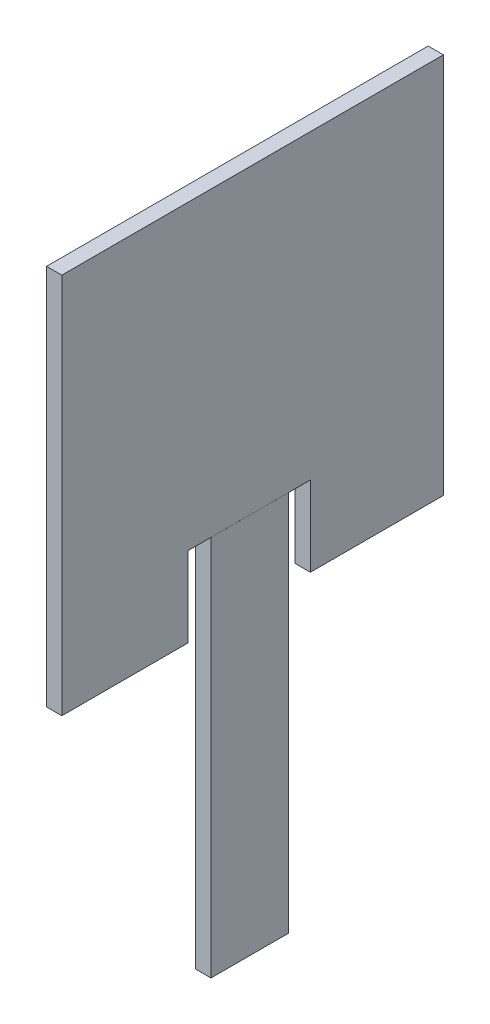
ISO-10303-21;
HEADER;
FILE_DESCRIPTION(('STEP AP214'),'2;1');
FILE_NAME('part.step','',(''),(''),'','','');
FILE_SCHEMA(('AUTOMOTIVE_DESIGN { 1 0 10303 214 1 1 1 1 }'));
ENDSEC;
DATA;
#1=APPLICATION_CONTEXT('core data for automotive mechanical design processes');
#2=APPLICATION_PROTOCOL_DEFINITION('international standard','automotive_design',2000,#1);
#3=PRODUCT_CONTEXT('',#1,'mechanical');
#4=PRODUCT('Part','Part','',(#3));
#5=PRODUCT_RELATED_PRODUCT_CATEGORY('part','',(#4));
#6=PRODUCT_DEFINITION_FORMATION('','',#4);
#7=PRODUCT_DEFINITION_CONTEXT('part definition',#1,'design');
#8=PRODUCT_DEFINITION('design','',#6,#7);
#9=PRODUCT_DEFINITION_SHAPE('','',#8);
#10=(LENGTH_UNIT() NAMED_UNIT(*) SI_UNIT(.MILLI.,.METRE.));
#11=(NAMED_UNIT(*) PLANE_ANGLE_UNIT() SI_UNIT($,.RADIAN.));
#12=(NAMED_UNIT(*) SI_UNIT($,.STERADIAN.) SOLID_ANGLE_UNIT());
#13=UNCERTAINTY_MEASURE_WITH_UNIT(LENGTH_MEASURE(1.E-05),#10,'distance_accuracy_value','');
#14=(GEOMETRIC_REPRESENTATION_CONTEXT(3) GLOBAL_UNCERTAINTY_ASSIGNED_CONTEXT((#13)) GLOBAL_UNIT_ASSIGNED_CONTEXT((#10,
#11,#12)) REPRESENTATION_CONTEXT('',''));
#15=CARTESIAN_POINT('',(0.,0.,0.));
#16=DIRECTION('',(0.,0.,1.));
#17=DIRECTION('',(1.,0.,0.));
#18=AXIS2_PLACEMENT_3D('',#15,#16,#17);
#19=CARTESIAN_POINT('',(-9.9,-0.726274688517492,0.421857304872253));
#20=DIRECTION('',(0.,1.,0.));
#21=DIRECTION('',(0.,0.,1.));
#22=AXIS2_PLACEMENT_3D('',#19,#20,#21);
#23=PLANE('',#22);
#24=DIRECTION('',(1.,0.,0.));
#25=VECTOR('',#24,1.);
#26=CARTESIAN_POINT('',(0.100034455726927,-0.726274688517492,-0.234016313603647));
#27=LINE('',#26,#25);
#28=CARTESIAN_POINT('',(0.,-0.726274688517492,-0.234016313603647));
#29=VERTEX_POINT('',#28);
#30=CARTESIAN_POINT('',(0.1,-0.726274688517492,-0.234016313603647));
#31=VERTEX_POINT('',#30);
#32=EDGE_CURVE('E48',#29,#31,#27,.T.);
#33=ORIENTED_EDGE('',*,*,#32,.F.);
#34=DIRECTION('',(0.,0.,1.));
#35=VECTOR('',#34,1.);
#36=CARTESIAN_POINT('',(0.,-0.726274688517492,0.));
#37=LINE('',#36,#35);
#38=CARTESIAN_POINT('',(0.,-0.726274688517492,-0.378142695127747));
#39=VERTEX_POINT('',#38);
#40=EDGE_CURVE('E151',#39,#29,#37,.T.);
#41=ORIENTED_EDGE('',*,*,#40,.F.);
#42=DIRECTION('',(1.,0.,0.));
#43=VECTOR('',#42,1.);
#44=CARTESIAN_POINT('',(-9.9,-0.726274688517492,-0.378142695127747));
#45=LINE('',#44,#43);
#46=CARTESIAN_POINT('',(0.1,-0.726274688517492,-0.378142695127747));
#47=VERTEX_POINT('',#46);
#48=EDGE_CURVE('E165',#39,#47,#45,.T.);
#49=ORIENTED_EDGE('',*,*,#48,.T.);
#50=DIRECTION('',(0.,0.,1.));
#51=VECTOR('',#50,1.);
#52=CARTESIAN_POINT('',(0.1,-0.726274688517492,0.421857304872253));
#53=LINE('',#52,#51);
#54=EDGE_CURVE('E160',#47,#31,#53,.T.);
#55=ORIENTED_EDGE('',*,*,#54,.T.);
#56=EDGE_LOOP('',(#33,#41,#49,#55));
#57=FACE_BOUND('',#56,.T.);
#58=ADVANCED_FACE('F33',(#57),#23,.F.);
#59=DIRECTION('',(-1.,0.,0.));
#60=VECTOR('',#59,1.);
#61=CARTESIAN_POINT('',(-9.9,-0.726274688517492,0.272866615841139));
#62=LINE('',#61,#60);
#63=CARTESIAN_POINT('',(0.1,-0.726274688517492,0.272866615841139));
#64=VERTEX_POINT('',#63);
#65=CARTESIAN_POINT('',(0.,-0.726274688517492,0.272866615841139));
#66=VERTEX_POINT('',#65);
#67=EDGE_CURVE('E11',#64,#66,#62,.T.);
#68=ORIENTED_EDGE('',*,*,#67,.F.);
#69=CARTESIAN_POINT('',(0.1,-0.726274688517492,0.421857304872253));
#70=VERTEX_POINT('',#69);
#71=EDGE_CURVE('E154',#64,#70,#53,.T.);
#72=ORIENTED_EDGE('',*,*,#71,.T.);
#73=DIRECTION('',(1.,0.,0.));
#74=VECTOR('',#73,1.);
#75=CARTESIAN_POINT('',(-9.9,-0.726274688517492,0.421857304872253));
#76=LINE('',#75,#74);
#77=CARTESIAN_POINT('',(0.,-0.726274688517492,0.421857304872253));
#78=VERTEX_POINT('',#77);
#79=EDGE_CURVE('E166',#78,#70,#76,.T.);
#80=ORIENTED_EDGE('',*,*,#79,.F.);
#81=EDGE_CURVE('E211',#66,#78,#37,.T.);
#82=ORIENTED_EDGE('',*,*,#81,.F.);
#83=EDGE_LOOP('',(#68,#72,#80,#82));
#84=FACE_BOUND('',#83,.T.);
#85=ADVANCED_FACE('F261',(#84),#23,.F.);
#86=CARTESIAN_POINT('',(0.1,-1.25,1.25));
#87=DIRECTION('',(0.,1.,0.));
#88=DIRECTION('',(0.,0.,1.));
#89=AXIS2_PLACEMENT_3D('',#86,#87,#88);
#90=PLANE('',#89);
#91=DIRECTION('',(0.,0.,-1.));
#92=VECTOR('',#91,1.);
#93=CARTESIAN_POINT('',(0.1,-1.25,1.25));
#94=LINE('',#93,#92);
#95=CARTESIAN_POINT('',(0.1,-1.25,-0.378142695127747));
#96=VERTEX_POINT('',#95);
#97=CARTESIAN_POINT('',(0.1,-1.25,-1.25));
#98=VERTEX_POINT('',#97);
#99=EDGE_CURVE('E186',#96,#98,#94,.T.);
#100=ORIENTED_EDGE('',*,*,#99,.F.);
#101=DIRECTION('',(-1.,0.,0.));
#102=VECTOR('',#101,1.);
#103=CARTESIAN_POINT('',(0.1,-1.25,-0.378142695127747));
#104=LINE('',#103,#102);
#105=CARTESIAN_POINT('',(0.,-1.25,-0.378142695127747));
#106=VERTEX_POINT('',#105);
#107=EDGE_CURVE('E174',#96,#106,#104,.T.);
#108=ORIENTED_EDGE('',*,*,#107,.T.);
#109=DIRECTION('',(0.,0.,-1.));
#110=VECTOR('',#109,1.);
#111=CARTESIAN_POINT('',(0.,-1.25,1.25));
#112=LINE('',#111,#110);
#113=CARTESIAN_POINT('',(0.,-1.25,-1.25));
#114=VERTEX_POINT('',#113);
#115=EDGE_CURVE('E197',#106,#114,#112,.T.);
#116=ORIENTED_EDGE('',*,*,#115,.T.);
#117=DIRECTION('',(-1.,0.,0.));
#118=VECTOR('',#117,1.);
#119=CARTESIAN_POINT('',(0.1,-1.25,-1.25));
#120=LINE('',#119,#118);
#121=EDGE_CURVE('E190',#98,#114,#120,.T.);
#122=ORIENTED_EDGE('',*,*,#121,.F.);
#123=EDGE_LOOP('',(#100,#108,#116,#122));
#124=FACE_BOUND('',#123,.T.);
#125=ADVANCED_FACE('F222',(#124),#90,.F.);
#126=CARTESIAN_POINT('',(0.1,1.25,-1.25));
#127=DIRECTION('',(0.,0.,1.));
#128=DIRECTION('',(0.,-1.,0.));
#129=AXIS2_PLACEMENT_3D('',#126,#127,#128);
#130=PLANE('',#129);
#131=DIRECTION('',(0.,1.,0.));
#132=VECTOR('',#131,1.);
#133=CARTESIAN_POINT('',(0.,1.25,-1.25));
#134=LINE('',#133,#132);
#135=CARTESIAN_POINT('',(0.,1.25,-1.25));
#136=VERTEX_POINT('',#135);
#137=EDGE_CURVE('E177',#114,#136,#134,.T.);
#138=ORIENTED_EDGE('',*,*,#137,.T.);
#139=DIRECTION('',(-1.,0.,0.));
#140=VECTOR('',#139,1.);
#141=CARTESIAN_POINT('',(0.1,1.25,-1.25));
#142=LINE('',#141,#140);
#143=CARTESIAN_POINT('',(0.1,1.25,-1.25));
#144=VERTEX_POINT('',#143);
#145=EDGE_CURVE('E208',#144,#136,#142,.T.);
#146=ORIENTED_EDGE('',*,*,#145,.F.);
#147=DIRECTION('',(0.,1.,0.));
#148=VECTOR('',#147,1.);
#149=CARTESIAN_POINT('',(0.1,1.25,-1.25));
#150=LINE('',#149,#148);
#151=EDGE_CURVE('E178',#98,#144,#150,.T.);
#152=ORIENTED_EDGE('',*,*,#151,.F.);
#153=ORIENTED_EDGE('',*,*,#121,.T.);
#154=EDGE_LOOP('',(#138,#146,#152,#153));
#155=FACE_BOUND('',#154,.T.);
#156=ADVANCED_FACE('F35',(#155),#130,.F.);
#157=CARTESIAN_POINT('',(0.1,1.25,1.25));
#158=DIRECTION('',(0.,-1.,0.));
#159=DIRECTION('',(0.,0.,-1.));
#160=AXIS2_PLACEMENT_3D('',#157,#158,#159);
#161=PLANE('',#160);
#162=DIRECTION('',(0.,0.,1.));
#163=VECTOR('',#162,1.);
#164=CARTESIAN_POINT('',(0.,1.25,1.25));
#165=LINE('',#164,#163);
#166=CARTESIAN_POINT('',(0.,1.25,1.25));
#167=VERTEX_POINT('',#166);
#168=EDGE_CURVE('E193',#136,#167,#165,.T.);
#169=ORIENTED_EDGE('',*,*,#168,.T.);
#170=DIRECTION('',(-1.,0.,0.));
#171=VECTOR('',#170,1.);
#172=CARTESIAN_POINT('',(0.1,1.25,1.25));
#173=LINE('',#172,#171);
#174=CARTESIAN_POINT('',(0.1,1.25,1.25));
#175=VERTEX_POINT('',#174);
#176=EDGE_CURVE('E205',#175,#167,#173,.T.);
#177=ORIENTED_EDGE('',*,*,#176,.F.);
#178=DIRECTION('',(0.,0.,1.));
#179=VECTOR('',#178,1.);
#180=CARTESIAN_POINT('',(0.1,1.25,1.25));
#181=LINE('',#180,#179);
#182=EDGE_CURVE('E181',#144,#175,#181,.T.);
#183=ORIENTED_EDGE('',*,*,#182,.F.);
#184=ORIENTED_EDGE('',*,*,#145,.T.);
#185=EDGE_LOOP('',(#169,#177,#183,#184));
#186=FACE_BOUND('',#185,.T.);
#187=ADVANCED_FACE('F280',(#186),#161,.F.);
#188=CARTESIAN_POINT('',(0.1,1.25,1.25));
#189=DIRECTION('',(0.,0.,-1.));
#190=DIRECTION('',(-1.,0.,0.));
#191=AXIS2_PLACEMENT_3D('',#188,#189,#190);
#192=PLANE('',#191);
#193=DIRECTION('',(0.,-1.,0.));
#194=VECTOR('',#193,1.);
#195=CARTESIAN_POINT('',(0.,1.25,1.25));
#196=LINE('',#195,#194);
#197=CARTESIAN_POINT('',(0.,-1.25,1.25));
#198=VERTEX_POINT('',#197);
#199=EDGE_CURVE('E195',#167,#198,#196,.T.);
#200=ORIENTED_EDGE('',*,*,#199,.T.);
#201=DIRECTION('',(-1.,0.,0.));
#202=VECTOR('',#201,1.);
#203=CARTESIAN_POINT('',(0.1,-1.25,1.25));
#204=LINE('',#203,#202);
#205=CARTESIAN_POINT('',(0.1,-1.25,1.25));
#206=VERTEX_POINT('',#205);
#207=EDGE_CURVE('E202',#206,#198,#204,.T.);
#208=ORIENTED_EDGE('',*,*,#207,.F.);
#209=DIRECTION('',(0.,-1.,0.));
#210=VECTOR('',#209,1.);
#211=CARTESIAN_POINT('',(0.1,1.25,1.25));
#212=LINE('',#211,#210);
#213=EDGE_CURVE('E184',#175,#206,#212,.T.);
#214=ORIENTED_EDGE('',*,*,#213,.F.);
#215=ORIENTED_EDGE('',*,*,#176,.T.);
#216=EDGE_LOOP('',(#200,#208,#214,#215));
#217=FACE_BOUND('',#216,.T.);
#218=ADVANCED_FACE('F277',(#217),#192,.F.);
#219=CARTESIAN_POINT('',(0.,-1.25,0.421857304872253));
#220=VERTEX_POINT('',#219);
#221=EDGE_CURVE('E182',#198,#220,#112,.T.);
#222=ORIENTED_EDGE('',*,*,#221,.T.);
#223=DIRECTION('',(1.,0.,0.));
#224=VECTOR('',#223,1.);
#225=CARTESIAN_POINT('',(0.1,-1.25,0.421857304872253));
#226=LINE('',#225,#224);
#227=CARTESIAN_POINT('',(0.1,-1.25,0.421857304872253));
#228=VERTEX_POINT('',#227);
#229=EDGE_CURVE('E169',#220,#228,#226,.T.);
#230=ORIENTED_EDGE('',*,*,#229,.T.);
#231=EDGE_CURVE('E187',#206,#228,#94,.T.);
#232=ORIENTED_EDGE('',*,*,#231,.F.);
#233=ORIENTED_EDGE('',*,*,#207,.T.);
#234=EDGE_LOOP('',(#222,#230,#232,#233));
#235=FACE_BOUND('',#234,.T.);
#236=ADVANCED_FACE('F272',(#235),#90,.F.);
#237=CARTESIAN_POINT('',(0.1,0.,0.));
#238=DIRECTION('',(1.,0.,0.));
#239=DIRECTION('',(0.,0.,-1.));
#240=AXIS2_PLACEMENT_3D('',#237,#238,#239);
#241=PLANE('',#240);
#242=DIRECTION('',(0.,1.,0.));
#243=VECTOR('',#242,1.);
#244=CARTESIAN_POINT('',(0.1,-1.64399945525417,-0.378142695127747));
#245=LINE('',#244,#243);
#246=EDGE_CURVE('E152',#96,#47,#245,.T.);
#247=ORIENTED_EDGE('',*,*,#246,.F.);
#248=ORIENTED_EDGE('',*,*,#99,.T.);
#249=ORIENTED_EDGE('',*,*,#151,.T.);
#250=ORIENTED_EDGE('',*,*,#182,.T.);
#251=ORIENTED_EDGE('',*,*,#213,.T.);
#252=ORIENTED_EDGE('',*,*,#231,.T.);
#253=DIRECTION('',(0.,-1.,0.));
#254=VECTOR('',#253,1.);
#255=CARTESIAN_POINT('',(0.1,-1.64399945525417,0.421857304872253));
#256=LINE('',#255,#254);
#257=EDGE_CURVE('E162',#70,#228,#256,.T.);
#258=ORIENTED_EDGE('',*,*,#257,.F.);
#259=ORIENTED_EDGE('',*,*,#71,.F.);
#260=EDGE_CURVE('E163',#31,#64,#53,.T.);
#261=ORIENTED_EDGE('',*,*,#260,.F.);
#262=ORIENTED_EDGE('',*,*,#54,.F.);
#263=EDGE_LOOP('',(#247,#248,#249,#250,#251,#252,#258,#259,#261,#262));
#264=FACE_BOUND('',#263,.T.);
#265=ADVANCED_FACE('F226',(#264),#241,.T.);
#266=CARTESIAN_POINT('',(0.,0.,0.));
#267=DIRECTION('',(1.,0.,0.));
#268=DIRECTION('',(0.,0.,-1.));
#269=AXIS2_PLACEMENT_3D('',#266,#267,#268);
#270=PLANE('',#269);
#271=ORIENTED_EDGE('',*,*,#115,.F.);
#272=DIRECTION('',(0.,1.,0.));
#273=VECTOR('',#272,1.);
#274=CARTESIAN_POINT('',(0.,0.,-0.378142695127747));
#275=LINE('',#274,#273);
#276=EDGE_CURVE('E41',#106,#39,#275,.T.);
#277=ORIENTED_EDGE('',*,*,#276,.T.);
#278=ORIENTED_EDGE('',*,*,#40,.T.);
#279=DIRECTION('',(0.,1.,0.));
#280=VECTOR('',#279,1.);
#281=CARTESIAN_POINT('',(0.,-3.22627468851749,-0.234016313603647));
#282=LINE('',#281,#280);
#283=CARTESIAN_POINT('',(0.,-3.22627468851749,-0.234016313603647));
#284=VERTEX_POINT('',#283);
#285=EDGE_CURVE('E131',#284,#29,#282,.T.);
#286=ORIENTED_EDGE('',*,*,#285,.F.);
#287=DIRECTION('',(0.,0.,-1.));
#288=VECTOR('',#287,1.);
#289=CARTESIAN_POINT('',(0.,-3.22627468851749,0.272866615841139));
#290=LINE('',#289,#288);
#291=CARTESIAN_POINT('',(0.,-3.22627468851749,0.272866615841139));
#292=VERTEX_POINT('',#291);
#293=EDGE_CURVE('E137',#292,#284,#290,.T.);
#294=ORIENTED_EDGE('',*,*,#293,.F.);
#295=DIRECTION('',(0.,1.,0.));
#296=VECTOR('',#295,1.);
#297=CARTESIAN_POINT('',(0.,-3.22627468851749,0.272866615841139));
#298=LINE('',#297,#296);
#299=EDGE_CURVE('E244',#292,#66,#298,.T.);
#300=ORIENTED_EDGE('',*,*,#299,.T.);
#301=ORIENTED_EDGE('',*,*,#81,.T.);
#302=DIRECTION('',(0.,-1.,0.));
#303=VECTOR('',#302,1.);
#304=CARTESIAN_POINT('',(0.,0.,0.421857304872253));
#305=LINE('',#304,#303);
#306=EDGE_CURVE('E213',#78,#220,#305,.T.);
#307=ORIENTED_EDGE('',*,*,#306,.T.);
#308=ORIENTED_EDGE('',*,*,#221,.F.);
#309=ORIENTED_EDGE('',*,*,#199,.F.);
#310=ORIENTED_EDGE('',*,*,#168,.F.);
#311=ORIENTED_EDGE('',*,*,#137,.F.);
#312=EDGE_LOOP('',(#271,#277,#278,#286,#294,#300,#301,#307,#308,#309,#310,#311));
#313=FACE_BOUND('',#312,.T.);
#314=ADVANCED_FACE('F149',(#313),#270,.F.);
#315=CARTESIAN_POINT('',(-9.9,-1.64399945525417,-0.378142695127747));
#316=DIRECTION('',(0.,0.,-1.));
#317=DIRECTION('',(-1.,0.,0.));
#318=AXIS2_PLACEMENT_3D('',#315,#316,#317);
#319=PLANE('',#318);
#320=ORIENTED_EDGE('',*,*,#246,.T.);
#321=ORIENTED_EDGE('',*,*,#48,.F.);
#322=ORIENTED_EDGE('',*,*,#276,.F.);
#323=ORIENTED_EDGE('',*,*,#107,.F.);
#324=EDGE_LOOP('',(#320,#321,#322,#323));
#325=FACE_BOUND('',#324,.T.);
#326=ADVANCED_FACE('F218',(#325),#319,.F.);
#327=CARTESIAN_POINT('',(-9.9,-1.64399945525417,0.421857304872253));
#328=DIRECTION('',(0.,0.,1.));
#329=DIRECTION('',(1.,0.,0.));
#330=AXIS2_PLACEMENT_3D('',#327,#328,#329);
#331=PLANE('',#330);
#332=ORIENTED_EDGE('',*,*,#306,.F.);
#333=ORIENTED_EDGE('',*,*,#79,.T.);
#334=ORIENTED_EDGE('',*,*,#257,.T.);
#335=ORIENTED_EDGE('',*,*,#229,.F.);
#336=EDGE_LOOP('',(#332,#333,#334,#335));
#337=FACE_BOUND('',#336,.T.);
#338=ADVANCED_FACE('F258',(#337),#331,.F.);
#339=CARTESIAN_POINT('',(0.100034455726927,-3.22627468851749,-0.234016313603647));
#340=DIRECTION('',(0.,0.,1.));
#341=DIRECTION('',(1.,0.,0.));
#342=AXIS2_PLACEMENT_3D('',#339,#340,#341);
#343=PLANE('',#342);
#344=ORIENTED_EDGE('',*,*,#32,.T.);
#345=CARTESIAN_POINT('',(0.100034455726927,-0.726274688517492,-0.234016313603647));
#346=VERTEX_POINT('',#345);
#347=EDGE_CURVE('E233',#31,#346,#27,.T.);
#348=ORIENTED_EDGE('',*,*,#347,.T.);
#349=DIRECTION('',(0.,1.,0.));
#350=VECTOR('',#349,1.);
#351=CARTESIAN_POINT('',(0.100034455726927,-3.22627468851749,-0.234016313603647));
#352=LINE('',#351,#350);
#353=CARTESIAN_POINT('',(0.100034455726927,-3.22627468851749,-0.234016313603647));
#354=VERTEX_POINT('',#353);
#355=EDGE_CURVE('E133',#354,#346,#352,.T.);
#356=ORIENTED_EDGE('',*,*,#355,.F.);
#357=DIRECTION('',(1.,0.,0.));
#358=VECTOR('',#357,1.);
#359=CARTESIAN_POINT('',(0.100034455726927,-3.22627468851749,-0.234016313603647));
#360=LINE('',#359,#358);
#361=EDGE_CURVE('E127',#284,#354,#360,.T.);
#362=ORIENTED_EDGE('',*,*,#361,.F.);
#363=ORIENTED_EDGE('',*,*,#285,.T.);
#364=EDGE_LOOP('',(#344,#348,#356,#362,#363));
#365=FACE_BOUND('',#364,.T.);
#366=ADVANCED_FACE('F129',(#365),#343,.F.);
#367=CARTESIAN_POINT('',(0.100034455726927,-3.22627468851749,0.272866615841139));
#368=DIRECTION('',(-1.,0.,0.));
#369=DIRECTION('',(0.,0.,1.));
#370=AXIS2_PLACEMENT_3D('',#367,#368,#369);
#371=PLANE('',#370);
#372=DIRECTION('',(0.,0.,1.));
#373=VECTOR('',#372,1.);
#374=CARTESIAN_POINT('',(0.100034455726927,-0.726274688517492,0.272866615841139));
#375=LINE('',#374,#373);
#376=CARTESIAN_POINT('',(0.100034455726927,-0.726274688517492,0.272866615841139));
#377=VERTEX_POINT('',#376);
#378=EDGE_CURVE('E237',#346,#377,#375,.T.);
#379=ORIENTED_EDGE('',*,*,#378,.T.);
#380=DIRECTION('',(0.,1.,0.));
#381=VECTOR('',#380,1.);
#382=CARTESIAN_POINT('',(0.100034455726927,-3.22627468851749,0.272866615841139));
#383=LINE('',#382,#381);
#384=CARTESIAN_POINT('',(0.100034455726927,-3.22627468851749,0.272866615841139));
#385=VERTEX_POINT('',#384);
#386=EDGE_CURVE('E156',#385,#377,#383,.T.);
#387=ORIENTED_EDGE('',*,*,#386,.F.);
#388=DIRECTION('',(0.,0.,1.));
#389=VECTOR('',#388,1.);
#390=CARTESIAN_POINT('',(0.100034455726927,-3.22627468851749,0.272866615841139));
#391=LINE('',#390,#389);
#392=EDGE_CURVE('E136',#354,#385,#391,.T.);
#393=ORIENTED_EDGE('',*,*,#392,.F.);
#394=ORIENTED_EDGE('',*,*,#355,.T.);
#395=EDGE_LOOP('',(#379,#387,#393,#394));
#396=FACE_BOUND('',#395,.T.);
#397=ADVANCED_FACE('F250',(#396),#371,.F.);
#398=CARTESIAN_POINT('',(0.100034455726927,-3.22627468851749,0.272866615841139));
#399=DIRECTION('',(0.,0.,-1.));
#400=DIRECTION('',(-1.,0.,0.));
#401=AXIS2_PLACEMENT_3D('',#398,#399,#400);
#402=PLANE('',#401);
#403=DIRECTION('',(-1.,0.,0.));
#404=VECTOR('',#403,1.);
#405=CARTESIAN_POINT('',(0.100034455726927,-0.726274688517492,0.272866615841139));
#406=LINE('',#405,#404);
#407=EDGE_CURVE('E146',#377,#64,#406,.T.);
#408=ORIENTED_EDGE('',*,*,#407,.T.);
#409=ORIENTED_EDGE('',*,*,#67,.T.);
#410=ORIENTED_EDGE('',*,*,#299,.F.);
#411=DIRECTION('',(-1.,0.,0.));
#412=VECTOR('',#411,1.);
#413=CARTESIAN_POINT('',(0.100034455726927,-3.22627468851749,0.272866615841139));
#414=LINE('',#413,#412);
#415=EDGE_CURVE('E142',#385,#292,#414,.T.);
#416=ORIENTED_EDGE('',*,*,#415,.F.);
#417=ORIENTED_EDGE('',*,*,#386,.T.);
#418=EDGE_LOOP('',(#408,#409,#410,#416,#417));
#419=FACE_BOUND('',#418,.T.);
#420=ADVANCED_FACE('F248',(#419),#402,.F.);
#421=CARTESIAN_POINT('',(0.,-3.22627468851749,0.));
#422=DIRECTION('',(0.,1.,0.));
#423=DIRECTION('',(0.,0.,1.));
#424=AXIS2_PLACEMENT_3D('',#421,#422,#423);
#425=PLANE('',#424);
#426=ORIENTED_EDGE('',*,*,#293,.T.);
#427=ORIENTED_EDGE('',*,*,#361,.T.);
#428=ORIENTED_EDGE('',*,*,#392,.T.);
#429=ORIENTED_EDGE('',*,*,#415,.T.);
#430=EDGE_LOOP('',(#426,#427,#428,#429));
#431=FACE_BOUND('',#430,.T.);
#432=ADVANCED_FACE('F140',(#431),#425,.F.);
#433=CARTESIAN_POINT('',(0.,-0.726274688517492,0.));
#434=DIRECTION('',(0.,1.,0.));
#435=DIRECTION('',(0.,0.,1.));
#436=AXIS2_PLACEMENT_3D('',#433,#434,#435);
#437=PLANE('',#436);
#438=ORIENTED_EDGE('',*,*,#347,.F.);
#439=ORIENTED_EDGE('',*,*,#260,.T.);
#440=ORIENTED_EDGE('',*,*,#407,.F.);
#441=ORIENTED_EDGE('',*,*,#378,.F.);
#442=EDGE_LOOP('',(#438,#439,#440,#441));
#443=FACE_BOUND('',#442,.T.);
#444=ADVANCED_FACE('F234',(#443),#437,.T.);
#445=CLOSED_SHELL('',(#58,#85,#125,#156,#187,#218,#236,#265,#314,#326,#338,#366,#397,#420,#432,#444));
#446=MANIFOLD_SOLID_BREP('B2',#445);
#447=ADVANCED_BREP_SHAPE_REPRESENTATION('',(#18,#446),#14);
#448=SHAPE_DEFINITION_REPRESENTATION(#9,#447);
ENDSEC;
END-ISO-10303-21;
